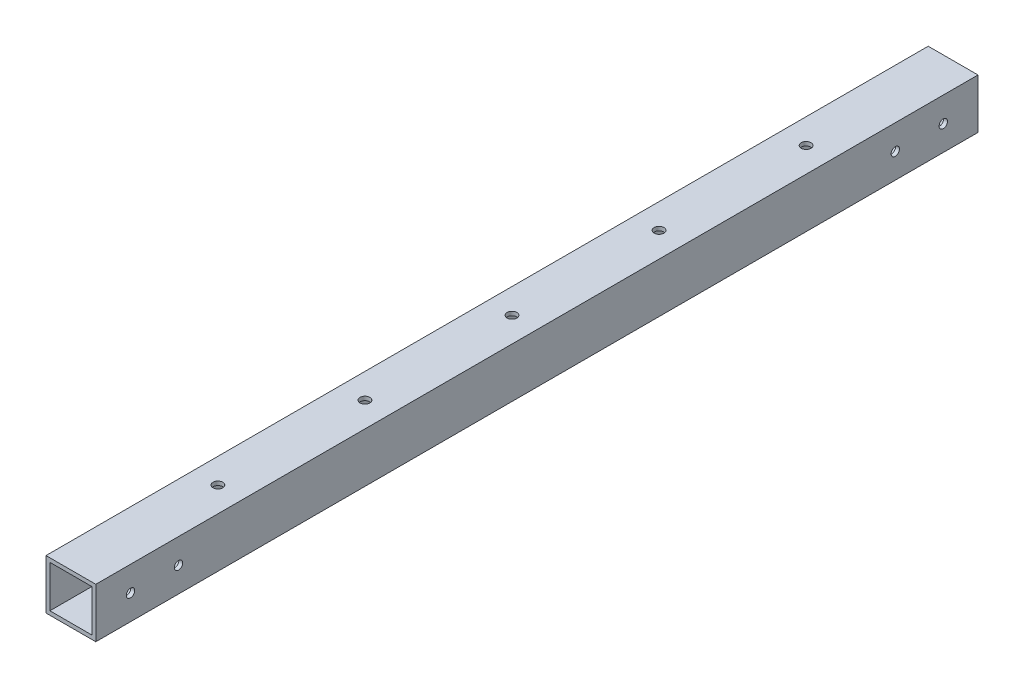
ISO-10303-21;
HEADER;
FILE_DESCRIPTION(('STEP AP214'),'2;1');
FILE_NAME('part.step','',(''),(''),'','','');
FILE_SCHEMA(('AUTOMOTIVE_DESIGN { 1 0 10303 214 1 1 1 1 }'));
ENDSEC;
DATA;
#1=APPLICATION_CONTEXT('core data for automotive mechanical design processes');
#2=APPLICATION_PROTOCOL_DEFINITION('international standard','automotive_design',2000,#1);
#3=PRODUCT_CONTEXT('',#1,'mechanical');
#4=PRODUCT('Part','Part','',(#3));
#5=PRODUCT_RELATED_PRODUCT_CATEGORY('part','',(#4));
#6=PRODUCT_DEFINITION_FORMATION('','',#4);
#7=PRODUCT_DEFINITION_CONTEXT('part definition',#1,'design');
#8=PRODUCT_DEFINITION('design','',#6,#7);
#9=PRODUCT_DEFINITION_SHAPE('','',#8);
#10=(LENGTH_UNIT() NAMED_UNIT(*) SI_UNIT(.MILLI.,.METRE.));
#11=(NAMED_UNIT(*) PLANE_ANGLE_UNIT() SI_UNIT($,.RADIAN.));
#12=(NAMED_UNIT(*) SI_UNIT($,.STERADIAN.) SOLID_ANGLE_UNIT());
#13=UNCERTAINTY_MEASURE_WITH_UNIT(LENGTH_MEASURE(1.E-05),#10,'distance_accuracy_value','');
#14=(GEOMETRIC_REPRESENTATION_CONTEXT(3) GLOBAL_UNCERTAINTY_ASSIGNED_CONTEXT((#13)) GLOBAL_UNIT_ASSIGNED_CONTEXT((#10,
#11,#12)) REPRESENTATION_CONTEXT('',''));
#15=CARTESIAN_POINT('',(0.,0.,0.));
#16=DIRECTION('',(0.,0.,1.));
#17=DIRECTION('',(1.,0.,0.));
#18=AXIS2_PLACEMENT_3D('',#15,#16,#17);
#19=CARTESIAN_POINT('',(0.,0.,450.));
#20=DIRECTION('',(0.,0.,1.));
#21=DIRECTION('',(1.,0.,0.));
#22=AXIS2_PLACEMENT_3D('',#19,#20,#21);
#23=PLANE('',#22);
#24=DIRECTION('',(0.,-1.,0.));
#25=VECTOR('',#24,1.);
#26=CARTESIAN_POINT('',(-12.7,12.7,450.));
#27=LINE('',#26,#25);
#28=CARTESIAN_POINT('',(-12.7,12.7,450.));
#29=VERTEX_POINT('',#28);
#30=CARTESIAN_POINT('',(-12.7,-12.7,450.));
#31=VERTEX_POINT('',#30);
#32=EDGE_CURVE('E140',#29,#31,#27,.T.);
#33=ORIENTED_EDGE('',*,*,#32,.T.);
#34=DIRECTION('',(1.,0.,0.));
#35=VECTOR('',#34,1.);
#36=CARTESIAN_POINT('',(-12.7,-12.7,450.));
#37=LINE('',#36,#35);
#38=CARTESIAN_POINT('',(12.7,-12.7,450.));
#39=VERTEX_POINT('',#38);
#40=EDGE_CURVE('E143',#31,#39,#37,.T.);
#41=ORIENTED_EDGE('',*,*,#40,.T.);
#42=DIRECTION('',(0.,-1.,0.));
#43=VECTOR('',#42,1.);
#44=CARTESIAN_POINT('',(12.7,12.7,450.));
#45=LINE('',#44,#43);
#46=CARTESIAN_POINT('',(12.7,12.7,450.));
#47=VERTEX_POINT('',#46);
#48=EDGE_CURVE('E146',#47,#39,#45,.T.);
#49=ORIENTED_EDGE('',*,*,#48,.F.);
#50=DIRECTION('',(1.,0.,0.));
#51=VECTOR('',#50,1.);
#52=CARTESIAN_POINT('',(-12.7,12.7,450.));
#53=LINE('',#52,#51);
#54=EDGE_CURVE('E149',#29,#47,#53,.T.);
#55=ORIENTED_EDGE('',*,*,#54,.F.);
#56=EDGE_LOOP('',(#33,#41,#49,#55));
#57=FACE_BOUND('',#56,.T.);
#58=DIRECTION('',(1.,0.,0.));
#59=VECTOR('',#58,1.);
#60=CARTESIAN_POINT('',(-10.7,-10.7,450.));
#61=LINE('',#60,#59);
#62=CARTESIAN_POINT('',(-10.7,-10.7,450.));
#63=VERTEX_POINT('',#62);
#64=CARTESIAN_POINT('',(10.7,-10.7,450.));
#65=VERTEX_POINT('',#64);
#66=EDGE_CURVE('E112',#63,#65,#61,.T.);
#67=ORIENTED_EDGE('',*,*,#66,.F.);
#68=DIRECTION('',(0.,-1.,0.));
#69=VECTOR('',#68,1.);
#70=CARTESIAN_POINT('',(-10.7,10.7,450.));
#71=LINE('',#70,#69);
#72=CARTESIAN_POINT('',(-10.7,10.7,450.));
#73=VERTEX_POINT('',#72);
#74=EDGE_CURVE('E103',#73,#63,#71,.T.);
#75=ORIENTED_EDGE('',*,*,#74,.F.);
#76=DIRECTION('',(1.,0.,0.));
#77=VECTOR('',#76,1.);
#78=CARTESIAN_POINT('',(-10.7,10.7,450.));
#79=LINE('',#78,#77);
#80=CARTESIAN_POINT('',(10.7,10.7,450.));
#81=VERTEX_POINT('',#80);
#82=EDGE_CURVE('E123',#73,#81,#79,.T.);
#83=ORIENTED_EDGE('',*,*,#82,.T.);
#84=DIRECTION('',(0.,-1.,0.));
#85=VECTOR('',#84,1.);
#86=CARTESIAN_POINT('',(10.7,10.7,450.));
#87=LINE('',#86,#85);
#88=EDGE_CURVE('E53',#81,#65,#87,.T.);
#89=ORIENTED_EDGE('',*,*,#88,.T.);
#90=EDGE_LOOP('',(#67,#75,#83,#89));
#91=FACE_BOUND('',#90,.T.);
#92=ADVANCED_FACE('F36',(#57,#91),#23,.T.);
#93=CARTESIAN_POINT('',(0.,0.,0.));
#94=DIRECTION('',(0.,0.,1.));
#95=DIRECTION('',(1.,0.,0.));
#96=AXIS2_PLACEMENT_3D('',#93,#94,#95);
#97=PLANE('',#96);
#98=DIRECTION('',(0.,-1.,0.));
#99=VECTOR('',#98,1.);
#100=CARTESIAN_POINT('',(-12.7,12.7,0.));
#101=LINE('',#100,#99);
#102=CARTESIAN_POINT('',(-12.7,12.7,0.));
#103=VERTEX_POINT('',#102);
#104=CARTESIAN_POINT('',(-12.7,-12.7,0.));
#105=VERTEX_POINT('',#104);
#106=EDGE_CURVE('E119',#103,#105,#101,.T.);
#107=ORIENTED_EDGE('',*,*,#106,.F.);
#108=DIRECTION('',(1.,0.,0.));
#109=VECTOR('',#108,1.);
#110=CARTESIAN_POINT('',(-12.7,12.7,0.));
#111=LINE('',#110,#109);
#112=CARTESIAN_POINT('',(12.7,12.7,0.));
#113=VERTEX_POINT('',#112);
#114=EDGE_CURVE('E144',#103,#113,#111,.T.);
#115=ORIENTED_EDGE('',*,*,#114,.T.);
#116=DIRECTION('',(0.,-1.,0.));
#117=VECTOR('',#116,1.);
#118=CARTESIAN_POINT('',(12.7,12.7,0.));
#119=LINE('',#118,#117);
#120=CARTESIAN_POINT('',(12.7,-12.7,0.));
#121=VERTEX_POINT('',#120);
#122=EDGE_CURVE('E158',#113,#121,#119,.T.);
#123=ORIENTED_EDGE('',*,*,#122,.T.);
#124=DIRECTION('',(1.,0.,0.));
#125=VECTOR('',#124,1.);
#126=CARTESIAN_POINT('',(-12.7,-12.7,0.));
#127=LINE('',#126,#125);
#128=EDGE_CURVE('E155',#105,#121,#127,.T.);
#129=ORIENTED_EDGE('',*,*,#128,.F.);
#130=EDGE_LOOP('',(#107,#115,#123,#129));
#131=FACE_BOUND('',#130,.T.);
#132=DIRECTION('',(0.,-1.,0.));
#133=VECTOR('',#132,1.);
#134=CARTESIAN_POINT('',(-10.7,10.7,0.));
#135=LINE('',#134,#133);
#136=CARTESIAN_POINT('',(-10.7,10.7,0.));
#137=VERTEX_POINT('',#136);
#138=CARTESIAN_POINT('',(-10.7,-10.7,0.));
#139=VERTEX_POINT('',#138);
#140=EDGE_CURVE('E61',#137,#139,#135,.T.);
#141=ORIENTED_EDGE('',*,*,#140,.T.);
#142=DIRECTION('',(1.,0.,0.));
#143=VECTOR('',#142,1.);
#144=CARTESIAN_POINT('',(-10.7,-10.7,0.));
#145=LINE('',#144,#143);
#146=CARTESIAN_POINT('',(10.7,-10.7,0.));
#147=VERTEX_POINT('',#146);
#148=EDGE_CURVE('E118',#139,#147,#145,.T.);
#149=ORIENTED_EDGE('',*,*,#148,.T.);
#150=DIRECTION('',(0.,-1.,0.));
#151=VECTOR('',#150,1.);
#152=CARTESIAN_POINT('',(10.7,10.7,0.));
#153=LINE('',#152,#151);
#154=CARTESIAN_POINT('',(10.7,10.7,0.));
#155=VERTEX_POINT('',#154);
#156=EDGE_CURVE('E131',#155,#147,#153,.T.);
#157=ORIENTED_EDGE('',*,*,#156,.F.);
#158=DIRECTION('',(1.,0.,0.));
#159=VECTOR('',#158,1.);
#160=CARTESIAN_POINT('',(-10.7,10.7,0.));
#161=LINE('',#160,#159);
#162=EDGE_CURVE('E113',#137,#155,#161,.T.);
#163=ORIENTED_EDGE('',*,*,#162,.F.);
#164=EDGE_LOOP('',(#141,#149,#157,#163));
#165=FACE_BOUND('',#164,.T.);
#166=ADVANCED_FACE('F269',(#131,#165),#97,.F.);
#167=CARTESIAN_POINT('',(-12.7,12.7,450.));
#168=DIRECTION('',(1.,0.,0.));
#169=DIRECTION('',(0.,1.,0.));
#170=AXIS2_PLACEMENT_3D('',#167,#168,#169);
#171=PLANE('',#170);
#172=CARTESIAN_POINT('',(-12.7,0.,375.));
#173=DIRECTION('',(-1.,0.,0.));
#174=DIRECTION('',(0.,-1.,0.));
#175=AXIS2_PLACEMENT_3D('',#172,#173,#174);
#176=CIRCLE('',#175,2.50000000000002);
#177=CARTESIAN_POINT('',(-12.7,-2.50000000000003,375.));
#178=VERTEX_POINT('',#177);
#179=EDGE_CURVE('E218',#178,#178,#176,.T.);
#180=ORIENTED_EDGE('',*,*,#179,.F.);
#181=EDGE_LOOP('',(#180));
#182=FACE_BOUND('',#181,.T.);
#183=CARTESIAN_POINT('',(-12.7,0.,300.));
#184=DIRECTION('',(-1.,0.,0.));
#185=DIRECTION('',(0.,-1.,0.));
#186=AXIS2_PLACEMENT_3D('',#183,#184,#185);
#187=CIRCLE('',#186,2.50000000000002);
#188=CARTESIAN_POINT('',(-12.7,-2.50000000000003,300.));
#189=VERTEX_POINT('',#188);
#190=EDGE_CURVE('E420',#189,#189,#187,.T.);
#191=ORIENTED_EDGE('',*,*,#190,.F.);
#192=EDGE_LOOP('',(#191));
#193=FACE_BOUND('',#192,.T.);
#194=CARTESIAN_POINT('',(-12.7,0.,225.));
#195=DIRECTION('',(-1.,0.,0.));
#196=DIRECTION('',(0.,-1.,0.));
#197=AXIS2_PLACEMENT_3D('',#194,#195,#196);
#198=CIRCLE('',#197,2.5);
#199=CARTESIAN_POINT('',(-12.7,-2.50000000000001,225.));
#200=VERTEX_POINT('',#199);
#201=EDGE_CURVE('E423',#200,#200,#198,.T.);
#202=ORIENTED_EDGE('',*,*,#201,.F.);
#203=EDGE_LOOP('',(#202));
#204=FACE_BOUND('',#203,.T.);
#205=CARTESIAN_POINT('',(-12.7,0.,150.));
#206=DIRECTION('',(-1.,0.,0.));
#207=DIRECTION('',(0.,-1.,0.));
#208=AXIS2_PLACEMENT_3D('',#205,#206,#207);
#209=CIRCLE('',#208,2.5);
#210=CARTESIAN_POINT('',(-12.7,-2.50000000000001,150.));
#211=VERTEX_POINT('',#210);
#212=EDGE_CURVE('E428',#211,#211,#209,.T.);
#213=ORIENTED_EDGE('',*,*,#212,.F.);
#214=EDGE_LOOP('',(#213));
#215=FACE_BOUND('',#214,.T.);
#216=CARTESIAN_POINT('',(-12.7,0.,75.));
#217=DIRECTION('',(-1.,0.,0.));
#218=DIRECTION('',(0.,-1.,0.));
#219=AXIS2_PLACEMENT_3D('',#216,#217,#218);
#220=CIRCLE('',#219,2.50000000000001);
#221=CARTESIAN_POINT('',(-12.7,-2.50000000000002,75.));
#222=VERTEX_POINT('',#221);
#223=EDGE_CURVE('E431',#222,#222,#220,.T.);
#224=ORIENTED_EDGE('',*,*,#223,.F.);
#225=EDGE_LOOP('',(#224));
#226=FACE_BOUND('',#225,.T.);
#227=ORIENTED_EDGE('',*,*,#106,.T.);
#228=DIRECTION('',(0.,0.,-1.));
#229=VECTOR('',#228,1.);
#230=CARTESIAN_POINT('',(-12.7,-12.7,450.));
#231=LINE('',#230,#229);
#232=EDGE_CURVE('E11',#31,#105,#231,.T.);
#233=ORIENTED_EDGE('',*,*,#232,.F.);
#234=ORIENTED_EDGE('',*,*,#32,.F.);
#235=DIRECTION('',(0.,0.,-1.));
#236=VECTOR('',#235,1.);
#237=CARTESIAN_POINT('',(-12.7,12.7,450.));
#238=LINE('',#237,#236);
#239=EDGE_CURVE('E152',#29,#103,#238,.T.);
#240=ORIENTED_EDGE('',*,*,#239,.T.);
#241=EDGE_LOOP('',(#227,#233,#234,#240));
#242=FACE_BOUND('',#241,.T.);
#243=ADVANCED_FACE('F38',(#182,#193,#204,#215,#226,#242),#171,.F.);
#244=CARTESIAN_POINT('',(-12.7,-12.7,450.));
#245=DIRECTION('',(0.,1.,0.));
#246=DIRECTION('',(0.,0.,1.));
#247=AXIS2_PLACEMENT_3D('',#244,#245,#246);
#248=PLANE('',#247);
#249=CARTESIAN_POINT('',(-9.97986415729457E-12,-12.7,407.8));
#250=DIRECTION('',(0.,-1.,0.));
#251=DIRECTION('',(0.,0.,-1.));
#252=AXIS2_PLACEMENT_3D('',#249,#250,#251);
#253=CIRCLE('',#252,2.14999999997024);
#254=CARTESIAN_POINT('',(-9.97986415729457E-12,-12.7,405.65000000003));
#255=VERTEX_POINT('',#254);
#256=EDGE_CURVE('E193',#255,#255,#253,.T.);
#257=ORIENTED_EDGE('',*,*,#256,.F.);
#258=EDGE_LOOP('',(#257));
#259=FACE_BOUND('',#258,.T.);
#260=CARTESIAN_POINT('',(-9.9703231781767E-12,-12.7,432.3));
#261=DIRECTION('',(0.,-1.,0.));
#262=DIRECTION('',(0.,0.,-1.));
#263=AXIS2_PLACEMENT_3D('',#260,#261,#262);
#264=CIRCLE('',#263,2.14999999997024);
#265=CARTESIAN_POINT('',(-9.9703231781767E-12,-12.7,430.15000000003));
#266=VERTEX_POINT('',#265);
#267=EDGE_CURVE('E213',#266,#266,#264,.T.);
#268=ORIENTED_EDGE('',*,*,#267,.F.);
#269=EDGE_LOOP('',(#268));
#270=FACE_BOUND('',#269,.T.);
#271=CARTESIAN_POINT('',(-2.38426899751287E-12,-12.7,17.6999999999975));
#272=DIRECTION('',(0.,-1.,0.));
#273=DIRECTION('',(0.,0.,-1.));
#274=AXIS2_PLACEMENT_3D('',#271,#272,#273);
#275=CIRCLE('',#274,2.14999999999999);
#276=CARTESIAN_POINT('',(-2.38426899751287E-12,-12.7,15.5499999999975));
#277=VERTEX_POINT('',#276);
#278=EDGE_CURVE('E170',#277,#277,#275,.T.);
#279=ORIENTED_EDGE('',*,*,#278,.F.);
#280=EDGE_LOOP('',(#279));
#281=FACE_BOUND('',#280,.T.);
#282=CARTESIAN_POINT('',(-2.30056858979699E-12,-12.7,42.1999999999975));
#283=DIRECTION('',(0.,-1.,0.));
#284=DIRECTION('',(0.,0.,-1.));
#285=AXIS2_PLACEMENT_3D('',#282,#283,#284);
#286=CIRCLE('',#285,2.15);
#287=CARTESIAN_POINT('',(-2.30056858979699E-12,-12.7,40.0499999999975));
#288=VERTEX_POINT('',#287);
#289=EDGE_CURVE('E180',#288,#288,#286,.T.);
#290=ORIENTED_EDGE('',*,*,#289,.F.);
#291=EDGE_LOOP('',(#290));
#292=FACE_BOUND('',#291,.T.);
#293=ORIENTED_EDGE('',*,*,#128,.T.);
#294=DIRECTION('',(0.,0.,-1.));
#295=VECTOR('',#294,1.);
#296=CARTESIAN_POINT('',(12.7,-12.7,450.));
#297=LINE('',#296,#295);
#298=EDGE_CURVE('E45',#39,#121,#297,.T.);
#299=ORIENTED_EDGE('',*,*,#298,.F.);
#300=ORIENTED_EDGE('',*,*,#40,.F.);
#301=ORIENTED_EDGE('',*,*,#232,.T.);
#302=EDGE_LOOP('',(#293,#299,#300,#301));
#303=FACE_BOUND('',#302,.T.);
#304=ADVANCED_FACE('F259',(#259,#270,#281,#292,#303),#248,.F.);
#305=CARTESIAN_POINT('',(12.7,12.7,450.));
#306=DIRECTION('',(1.,0.,0.));
#307=DIRECTION('',(0.,1.,0.));
#308=AXIS2_PLACEMENT_3D('',#305,#306,#307);
#309=PLANE('',#308);
#310=CARTESIAN_POINT('',(12.7,0.,407.8));
#311=DIRECTION('',(1.,0.,0.));
#312=DIRECTION('',(0.,1.,0.));
#313=AXIS2_PLACEMENT_3D('',#310,#311,#312);
#314=CIRCLE('',#313,2.15000000000002);
#315=CARTESIAN_POINT('',(12.7,2.15000000000002,407.8));
#316=VERTEX_POINT('',#315);
#317=EDGE_CURVE('E185',#316,#316,#314,.T.);
#318=ORIENTED_EDGE('',*,*,#317,.F.);
#319=EDGE_LOOP('',(#318));
#320=FACE_BOUND('',#319,.T.);
#321=CARTESIAN_POINT('',(12.7,0.,432.3));
#322=DIRECTION('',(1.,0.,0.));
#323=DIRECTION('',(0.,1.,0.));
#324=AXIS2_PLACEMENT_3D('',#321,#322,#323);
#325=CIRCLE('',#324,2.15000000000002);
#326=CARTESIAN_POINT('',(12.7,2.15000000000001,432.3));
#327=VERTEX_POINT('',#326);
#328=EDGE_CURVE('E196',#327,#327,#325,.T.);
#329=ORIENTED_EDGE('',*,*,#328,.F.);
#330=EDGE_LOOP('',(#329));
#331=FACE_BOUND('',#330,.T.);
#332=CARTESIAN_POINT('',(12.7,-1.45477441250132E-13,42.1999999999975));
#333=DIRECTION('',(1.,0.,0.));
#334=DIRECTION('',(0.,1.,0.));
#335=AXIS2_PLACEMENT_3D('',#332,#333,#334);
#336=CIRCLE('',#335,2.14999999986953);
#337=CARTESIAN_POINT('',(12.7,2.14999999986938,42.1999999999975));
#338=VERTEX_POINT('',#337);
#339=EDGE_CURVE('E177',#338,#338,#336,.T.);
#340=ORIENTED_EDGE('',*,*,#339,.F.);
#341=EDGE_LOOP('',(#340));
#342=FACE_BOUND('',#341,.T.);
#343=CARTESIAN_POINT('',(12.7,-1.45717245263134E-13,17.6999999999975));
#344=DIRECTION('',(1.,0.,0.));
#345=DIRECTION('',(0.,1.,0.));
#346=AXIS2_PLACEMENT_3D('',#343,#344,#345);
#347=CIRCLE('',#346,2.14999999975027);
#348=CARTESIAN_POINT('',(12.7,2.14999999975012,17.6999999999975));
#349=VERTEX_POINT('',#348);
#350=EDGE_CURVE('E188',#349,#349,#347,.T.);
#351=ORIENTED_EDGE('',*,*,#350,.F.);
#352=EDGE_LOOP('',(#351));
#353=FACE_BOUND('',#352,.T.);
#354=ORIENTED_EDGE('',*,*,#122,.F.);
#355=DIRECTION('',(0.,0.,-1.));
#356=VECTOR('',#355,1.);
#357=CARTESIAN_POINT('',(12.7,12.7,450.));
#358=LINE('',#357,#356);
#359=EDGE_CURVE('E164',#47,#113,#358,.T.);
#360=ORIENTED_EDGE('',*,*,#359,.F.);
#361=ORIENTED_EDGE('',*,*,#48,.T.);
#362=ORIENTED_EDGE('',*,*,#298,.T.);
#363=EDGE_LOOP('',(#354,#360,#361,#362));
#364=FACE_BOUND('',#363,.T.);
#365=ADVANCED_FACE('F262',(#320,#331,#342,#353,#364),#309,.T.);
#366=CARTESIAN_POINT('',(-12.7,12.7,450.));
#367=DIRECTION('',(0.,1.,0.));
#368=DIRECTION('',(0.,0.,1.));
#369=AXIS2_PLACEMENT_3D('',#366,#367,#368);
#370=PLANE('',#369);
#371=CARTESIAN_POINT('',(0.,12.7,375.));
#372=DIRECTION('',(0.,1.,0.));
#373=DIRECTION('',(0.,0.,1.));
#374=AXIS2_PLACEMENT_3D('',#371,#372,#373);
#375=CIRCLE('',#374,2.5);
#376=CARTESIAN_POINT('',(0.,12.7,377.5));
#377=VERTEX_POINT('',#376);
#378=EDGE_CURVE('E201',#377,#377,#375,.T.);
#379=ORIENTED_EDGE('',*,*,#378,.F.);
#380=EDGE_LOOP('',(#379));
#381=FACE_BOUND('',#380,.T.);
#382=CARTESIAN_POINT('',(0.,12.7,300.));
#383=DIRECTION('',(0.,1.,0.));
#384=DIRECTION('',(0.,0.,1.));
#385=AXIS2_PLACEMENT_3D('',#382,#383,#384);
#386=CIRCLE('',#385,2.5);
#387=CARTESIAN_POINT('',(0.,12.7,302.5));
#388=VERTEX_POINT('',#387);
#389=EDGE_CURVE('E436',#388,#388,#386,.T.);
#390=ORIENTED_EDGE('',*,*,#389,.F.);
#391=EDGE_LOOP('',(#390));
#392=FACE_BOUND('',#391,.T.);
#393=CARTESIAN_POINT('',(0.,12.7,225.));
#394=DIRECTION('',(0.,1.,0.));
#395=DIRECTION('',(0.,0.,1.));
#396=AXIS2_PLACEMENT_3D('',#393,#394,#395);
#397=CIRCLE('',#396,2.5);
#398=CARTESIAN_POINT('',(0.,12.7,227.5));
#399=VERTEX_POINT('',#398);
#400=EDGE_CURVE('E237',#399,#399,#397,.T.);
#401=ORIENTED_EDGE('',*,*,#400,.F.);
#402=EDGE_LOOP('',(#401));
#403=FACE_BOUND('',#402,.T.);
#404=CARTESIAN_POINT('',(0.,12.7,150.));
#405=DIRECTION('',(0.,1.,0.));
#406=DIRECTION('',(0.,0.,1.));
#407=AXIS2_PLACEMENT_3D('',#404,#405,#406);
#408=CIRCLE('',#407,2.5);
#409=CARTESIAN_POINT('',(0.,12.7,152.5));
#410=VERTEX_POINT('',#409);
#411=EDGE_CURVE('E232',#410,#410,#408,.T.);
#412=ORIENTED_EDGE('',*,*,#411,.F.);
#413=EDGE_LOOP('',(#412));
#414=FACE_BOUND('',#413,.T.);
#415=CARTESIAN_POINT('',(0.,12.7,75.));
#416=DIRECTION('',(0.,1.,0.));
#417=DIRECTION('',(0.,0.,1.));
#418=AXIS2_PLACEMENT_3D('',#415,#416,#417);
#419=CIRCLE('',#418,2.5);
#420=CARTESIAN_POINT('',(0.,12.7,77.5));
#421=VERTEX_POINT('',#420);
#422=EDGE_CURVE('E228',#421,#421,#419,.T.);
#423=ORIENTED_EDGE('',*,*,#422,.F.);
#424=EDGE_LOOP('',(#423));
#425=FACE_BOUND('',#424,.T.);
#426=ORIENTED_EDGE('',*,*,#114,.F.);
#427=ORIENTED_EDGE('',*,*,#239,.F.);
#428=ORIENTED_EDGE('',*,*,#54,.T.);
#429=ORIENTED_EDGE('',*,*,#359,.T.);
#430=EDGE_LOOP('',(#426,#427,#428,#429));
#431=FACE_BOUND('',#430,.T.);
#432=ADVANCED_FACE('F277',(#381,#392,#403,#414,#425,#431),#370,.T.);
#433=CARTESIAN_POINT('',(-10.7,10.7,450.));
#434=DIRECTION('',(1.,0.,0.));
#435=DIRECTION('',(0.,0.,-1.));
#436=AXIS2_PLACEMENT_3D('',#433,#434,#435);
#437=PLANE('',#436);
#438=CARTESIAN_POINT('',(-10.7,0.,375.));
#439=DIRECTION('',(1.,0.,0.));
#440=DIRECTION('',(0.,0.,-1.));
#441=AXIS2_PLACEMENT_3D('',#438,#439,#440);
#442=CIRCLE('',#441,2.50000000000002);
#443=CARTESIAN_POINT('',(-10.7,0.,372.5));
#444=VERTEX_POINT('',#443);
#445=EDGE_CURVE('E40',#444,#444,#442,.T.);
#446=ORIENTED_EDGE('',*,*,#445,.F.);
#447=EDGE_LOOP('',(#446));
#448=FACE_BOUND('',#447,.T.);
#449=CARTESIAN_POINT('',(-10.7,0.,300.));
#450=DIRECTION('',(1.,0.,0.));
#451=DIRECTION('',(0.,0.,-1.));
#452=AXIS2_PLACEMENT_3D('',#449,#450,#451);
#453=CIRCLE('',#452,2.50000000000002);
#454=CARTESIAN_POINT('',(-10.7,0.,297.5));
#455=VERTEX_POINT('',#454);
#456=EDGE_CURVE('E223',#455,#455,#453,.T.);
#457=ORIENTED_EDGE('',*,*,#456,.F.);
#458=EDGE_LOOP('',(#457));
#459=FACE_BOUND('',#458,.T.);
#460=CARTESIAN_POINT('',(-10.7,0.,225.));
#461=DIRECTION('',(1.,0.,0.));
#462=DIRECTION('',(0.,0.,-1.));
#463=AXIS2_PLACEMENT_3D('',#460,#461,#462);
#464=CIRCLE('',#463,2.5);
#465=CARTESIAN_POINT('',(-10.7,0.,222.5));
#466=VERTEX_POINT('',#465);
#467=EDGE_CURVE('E221',#466,#466,#464,.T.);
#468=ORIENTED_EDGE('',*,*,#467,.F.);
#469=EDGE_LOOP('',(#468));
#470=FACE_BOUND('',#469,.T.);
#471=CARTESIAN_POINT('',(-10.7,0.,150.));
#472=DIRECTION('',(1.,0.,0.));
#473=DIRECTION('',(0.,0.,-1.));
#474=AXIS2_PLACEMENT_3D('',#471,#472,#473);
#475=CIRCLE('',#474,2.5);
#476=CARTESIAN_POINT('',(-10.7,0.,147.5));
#477=VERTEX_POINT('',#476);
#478=EDGE_CURVE('E217',#477,#477,#475,.T.);
#479=ORIENTED_EDGE('',*,*,#478,.F.);
#480=EDGE_LOOP('',(#479));
#481=FACE_BOUND('',#480,.T.);
#482=CARTESIAN_POINT('',(-10.7,0.,75.));
#483=DIRECTION('',(1.,0.,0.));
#484=DIRECTION('',(0.,0.,-1.));
#485=AXIS2_PLACEMENT_3D('',#482,#483,#484);
#486=CIRCLE('',#485,2.50000000000001);
#487=CARTESIAN_POINT('',(-10.7,0.,72.5));
#488=VERTEX_POINT('',#487);
#489=EDGE_CURVE('E214',#488,#488,#486,.T.);
#490=ORIENTED_EDGE('',*,*,#489,.F.);
#491=EDGE_LOOP('',(#490));
#492=FACE_BOUND('',#491,.T.);
#493=ORIENTED_EDGE('',*,*,#140,.F.);
#494=DIRECTION('',(0.,0.,-1.));
#495=VECTOR('',#494,1.);
#496=CARTESIAN_POINT('',(-10.7,10.7,450.));
#497=LINE('',#496,#495);
#498=EDGE_CURVE('E107',#73,#137,#497,.T.);
#499=ORIENTED_EDGE('',*,*,#498,.F.);
#500=ORIENTED_EDGE('',*,*,#74,.T.);
#501=DIRECTION('',(0.,0.,-1.));
#502=VECTOR('',#501,1.);
#503=CARTESIAN_POINT('',(-10.7,-10.7,450.));
#504=LINE('',#503,#502);
#505=EDGE_CURVE('E106',#63,#139,#504,.T.);
#506=ORIENTED_EDGE('',*,*,#505,.T.);
#507=EDGE_LOOP('',(#493,#499,#500,#506));
#508=FACE_BOUND('',#507,.T.);
#509=ADVANCED_FACE('F105',(#448,#459,#470,#481,#492,#508),#437,.T.);
#510=CARTESIAN_POINT('',(-10.7,-10.7,450.));
#511=DIRECTION('',(0.,1.,0.));
#512=DIRECTION('',(-1.,0.,0.));
#513=AXIS2_PLACEMENT_3D('',#510,#511,#512);
#514=PLANE('',#513);
#515=CARTESIAN_POINT('',(-9.97986415729457E-12,-10.7,407.8));
#516=DIRECTION('',(0.,1.,0.));
#517=DIRECTION('',(-1.,0.,0.));
#518=AXIS2_PLACEMENT_3D('',#515,#516,#517);
#519=CIRCLE('',#518,2.14999999997024);
#520=CARTESIAN_POINT('',(-2.14999999998022,-10.7,407.8));
#521=VERTEX_POINT('',#520);
#522=EDGE_CURVE('E192',#521,#521,#519,.T.);
#523=ORIENTED_EDGE('',*,*,#522,.F.);
#524=EDGE_LOOP('',(#523));
#525=FACE_BOUND('',#524,.T.);
#526=CARTESIAN_POINT('',(-9.9703231781767E-12,-10.7,432.3));
#527=DIRECTION('',(0.,1.,0.));
#528=DIRECTION('',(-1.,0.,0.));
#529=AXIS2_PLACEMENT_3D('',#526,#527,#528);
#530=CIRCLE('',#529,2.14999999997024);
#531=CARTESIAN_POINT('',(-2.14999999998021,-10.7,432.3));
#532=VERTEX_POINT('',#531);
#533=EDGE_CURVE('E189',#532,#532,#530,.T.);
#534=ORIENTED_EDGE('',*,*,#533,.F.);
#535=EDGE_LOOP('',(#534));
#536=FACE_BOUND('',#535,.T.);
#537=CARTESIAN_POINT('',(-2.38426899751287E-12,-10.7,17.6999999999975));
#538=DIRECTION('',(0.,1.,0.));
#539=DIRECTION('',(-1.,0.,0.));
#540=AXIS2_PLACEMENT_3D('',#537,#538,#539);
#541=CIRCLE('',#540,2.14999999999999);
#542=CARTESIAN_POINT('',(-2.15000000000237,-10.7,17.6999999999975));
#543=VERTEX_POINT('',#542);
#544=EDGE_CURVE('E129',#543,#543,#541,.T.);
#545=ORIENTED_EDGE('',*,*,#544,.F.);
#546=EDGE_LOOP('',(#545));
#547=FACE_BOUND('',#546,.T.);
#548=CARTESIAN_POINT('',(-2.30056858979699E-12,-10.7,42.1999999999975));
#549=DIRECTION('',(0.,1.,0.));
#550=DIRECTION('',(-1.,0.,0.));
#551=AXIS2_PLACEMENT_3D('',#548,#549,#550);
#552=CIRCLE('',#551,2.15);
#553=CARTESIAN_POINT('',(-2.1500000000023,-10.7,42.1999999999975));
#554=VERTEX_POINT('',#553);
#555=EDGE_CURVE('E167',#554,#554,#552,.T.);
#556=ORIENTED_EDGE('',*,*,#555,.F.);
#557=EDGE_LOOP('',(#556));
#558=FACE_BOUND('',#557,.T.);
#559=ORIENTED_EDGE('',*,*,#148,.F.);
#560=ORIENTED_EDGE('',*,*,#505,.F.);
#561=ORIENTED_EDGE('',*,*,#66,.T.);
#562=DIRECTION('',(0.,0.,-1.));
#563=VECTOR('',#562,1.);
#564=CARTESIAN_POINT('',(10.7,-10.7,450.));
#565=LINE('',#564,#563);
#566=EDGE_CURVE('E120',#65,#147,#565,.T.);
#567=ORIENTED_EDGE('',*,*,#566,.T.);
#568=EDGE_LOOP('',(#559,#560,#561,#567));
#569=FACE_BOUND('',#568,.T.);
#570=ADVANCED_FACE('F116',(#525,#536,#547,#558,#569),#514,.T.);
#571=CARTESIAN_POINT('',(10.7,10.7,450.));
#572=DIRECTION('',(1.,0.,0.));
#573=DIRECTION('',(0.,1.,0.));
#574=AXIS2_PLACEMENT_3D('',#571,#572,#573);
#575=PLANE('',#574);
#576=CARTESIAN_POINT('',(10.7,0.,407.8));
#577=DIRECTION('',(1.,0.,0.));
#578=DIRECTION('',(0.,1.,0.));
#579=AXIS2_PLACEMENT_3D('',#576,#577,#578);
#580=CIRCLE('',#579,2.15000000000002);
#581=CARTESIAN_POINT('',(10.7,2.15000000000002,407.8));
#582=VERTEX_POINT('',#581);
#583=EDGE_CURVE('E184',#582,#582,#580,.T.);
#584=ORIENTED_EDGE('',*,*,#583,.T.);
#585=EDGE_LOOP('',(#584));
#586=FACE_BOUND('',#585,.T.);
#587=CARTESIAN_POINT('',(10.7,0.,432.3));
#588=DIRECTION('',(1.,0.,0.));
#589=DIRECTION('',(0.,1.,0.));
#590=AXIS2_PLACEMENT_3D('',#587,#588,#589);
#591=CIRCLE('',#590,2.15000000000002);
#592=CARTESIAN_POINT('',(10.7,2.15000000000001,432.3));
#593=VERTEX_POINT('',#592);
#594=EDGE_CURVE('E181',#593,#593,#591,.T.);
#595=ORIENTED_EDGE('',*,*,#594,.T.);
#596=EDGE_LOOP('',(#595));
#597=FACE_BOUND('',#596,.T.);
#598=CARTESIAN_POINT('',(10.7,-1.45750626049499E-13,42.1999999999975));
#599=DIRECTION('',(1.,0.,0.));
#600=DIRECTION('',(0.,1.,0.));
#601=AXIS2_PLACEMENT_3D('',#598,#599,#600);
#602=CIRCLE('',#601,2.14999999986953);
#603=CARTESIAN_POINT('',(10.7,2.14999999986938,42.1999999999975));
#604=VERTEX_POINT('',#603);
#605=EDGE_CURVE('E176',#604,#604,#602,.T.);
#606=ORIENTED_EDGE('',*,*,#605,.T.);
#607=EDGE_LOOP('',(#606));
#608=FACE_BOUND('',#607,.T.);
#609=CARTESIAN_POINT('',(10.7,-1.45990430062501E-13,17.6999999999975));
#610=DIRECTION('',(1.,0.,0.));
#611=DIRECTION('',(0.,1.,0.));
#612=AXIS2_PLACEMENT_3D('',#609,#610,#611);
#613=CIRCLE('',#612,2.14999999975027);
#614=CARTESIAN_POINT('',(10.7,2.14999999975012,17.6999999999975));
#615=VERTEX_POINT('',#614);
#616=EDGE_CURVE('E173',#615,#615,#613,.T.);
#617=ORIENTED_EDGE('',*,*,#616,.T.);
#618=EDGE_LOOP('',(#617));
#619=FACE_BOUND('',#618,.T.);
#620=ORIENTED_EDGE('',*,*,#156,.T.);
#621=ORIENTED_EDGE('',*,*,#566,.F.);
#622=ORIENTED_EDGE('',*,*,#88,.F.);
#623=DIRECTION('',(0.,0.,-1.));
#624=VECTOR('',#623,1.);
#625=CARTESIAN_POINT('',(10.7,10.7,450.));
#626=LINE('',#625,#624);
#627=EDGE_CURVE('E137',#81,#155,#626,.T.);
#628=ORIENTED_EDGE('',*,*,#627,.T.);
#629=EDGE_LOOP('',(#620,#621,#622,#628));
#630=FACE_BOUND('',#629,.T.);
#631=ADVANCED_FACE('F322',(#586,#597,#608,#619,#630),#575,.F.);
#632=CARTESIAN_POINT('',(-10.7,10.7,450.));
#633=DIRECTION('',(0.,1.,0.));
#634=DIRECTION('',(0.,0.,1.));
#635=AXIS2_PLACEMENT_3D('',#632,#633,#634);
#636=PLANE('',#635);
#637=CARTESIAN_POINT('',(0.,10.7,375.));
#638=DIRECTION('',(0.,1.,0.));
#639=DIRECTION('',(0.,0.,1.));
#640=AXIS2_PLACEMENT_3D('',#637,#638,#639);
#641=CIRCLE('',#640,2.5);
#642=CARTESIAN_POINT('',(0.,10.7,377.5));
#643=VERTEX_POINT('',#642);
#644=EDGE_CURVE('E210',#643,#643,#641,.T.);
#645=ORIENTED_EDGE('',*,*,#644,.T.);
#646=EDGE_LOOP('',(#645));
#647=FACE_BOUND('',#646,.T.);
#648=CARTESIAN_POINT('',(0.,10.7,300.));
#649=DIRECTION('',(0.,1.,0.));
#650=DIRECTION('',(0.,0.,1.));
#651=AXIS2_PLACEMENT_3D('',#648,#649,#650);
#652=CIRCLE('',#651,2.5);
#653=CARTESIAN_POINT('',(0.,10.7,302.5));
#654=VERTEX_POINT('',#653);
#655=EDGE_CURVE('E207',#654,#654,#652,.T.);
#656=ORIENTED_EDGE('',*,*,#655,.T.);
#657=EDGE_LOOP('',(#656));
#658=FACE_BOUND('',#657,.T.);
#659=CARTESIAN_POINT('',(0.,10.7,225.));
#660=DIRECTION('',(0.,1.,0.));
#661=DIRECTION('',(0.,0.,1.));
#662=AXIS2_PLACEMENT_3D('',#659,#660,#661);
#663=CIRCLE('',#662,2.5);
#664=CARTESIAN_POINT('',(0.,10.7,227.5));
#665=VERTEX_POINT('',#664);
#666=EDGE_CURVE('E204',#665,#665,#663,.T.);
#667=ORIENTED_EDGE('',*,*,#666,.T.);
#668=EDGE_LOOP('',(#667));
#669=FACE_BOUND('',#668,.T.);
#670=CARTESIAN_POINT('',(0.,10.7,150.));
#671=DIRECTION('',(0.,1.,0.));
#672=DIRECTION('',(0.,0.,1.));
#673=AXIS2_PLACEMENT_3D('',#670,#671,#672);
#674=CIRCLE('',#673,2.5);
#675=CARTESIAN_POINT('',(0.,10.7,152.5));
#676=VERTEX_POINT('',#675);
#677=EDGE_CURVE('E200',#676,#676,#674,.T.);
#678=ORIENTED_EDGE('',*,*,#677,.T.);
#679=EDGE_LOOP('',(#678));
#680=FACE_BOUND('',#679,.T.);
#681=CARTESIAN_POINT('',(0.,10.7,75.));
#682=DIRECTION('',(0.,1.,0.));
#683=DIRECTION('',(0.,0.,1.));
#684=AXIS2_PLACEMENT_3D('',#681,#682,#683);
#685=CIRCLE('',#684,2.5);
#686=CARTESIAN_POINT('',(0.,10.7,77.5));
#687=VERTEX_POINT('',#686);
#688=EDGE_CURVE('E197',#687,#687,#685,.T.);
#689=ORIENTED_EDGE('',*,*,#688,.T.);
#690=EDGE_LOOP('',(#689));
#691=FACE_BOUND('',#690,.T.);
#692=ORIENTED_EDGE('',*,*,#162,.T.);
#693=ORIENTED_EDGE('',*,*,#627,.F.);
#694=ORIENTED_EDGE('',*,*,#82,.F.);
#695=ORIENTED_EDGE('',*,*,#498,.T.);
#696=EDGE_LOOP('',(#692,#693,#694,#695));
#697=FACE_BOUND('',#696,.T.);
#698=ADVANCED_FACE('F323',(#647,#658,#669,#680,#691,#697),#636,.F.);
#699=CARTESIAN_POINT('',(-2.30056858979699E-12,-9.7,42.1999999999975));
#700=DIRECTION('',(0.,-1.,0.));
#701=DIRECTION('',(0.,0.,-1.));
#702=AXIS2_PLACEMENT_3D('',#699,#700,#701);
#703=CYLINDRICAL_SURFACE('',#702,2.15);
#704=ORIENTED_EDGE('',*,*,#555,.T.);
#705=EDGE_LOOP('',(#704));
#706=FACE_BOUND('',#705,.T.);
#707=ORIENTED_EDGE('',*,*,#289,.T.);
#708=EDGE_LOOP('',(#707));
#709=FACE_BOUND('',#708,.T.);
#710=ADVANCED_FACE('F257',(#706,#709),#703,.F.);
#711=CARTESIAN_POINT('',(-2.38426899751287E-12,-9.7,17.6999999999975));
#712=DIRECTION('',(0.,-1.,0.));
#713=DIRECTION('',(0.,0.,-1.));
#714=AXIS2_PLACEMENT_3D('',#711,#712,#713);
#715=CYLINDRICAL_SURFACE('',#714,2.14999999999999);
#716=ORIENTED_EDGE('',*,*,#544,.T.);
#717=EDGE_LOOP('',(#716));
#718=FACE_BOUND('',#717,.T.);
#719=ORIENTED_EDGE('',*,*,#278,.T.);
#720=EDGE_LOOP('',(#719));
#721=FACE_BOUND('',#720,.T.);
#722=ADVANCED_FACE('F318',(#718,#721),#715,.F.);
#723=CARTESIAN_POINT('',(9.7,-1.46127022462184E-13,17.6999999999975));
#724=DIRECTION('',(1.,0.,0.));
#725=DIRECTION('',(0.,1.,0.));
#726=AXIS2_PLACEMENT_3D('',#723,#724,#725);
#727=CYLINDRICAL_SURFACE('',#726,2.14999999975027);
#728=ORIENTED_EDGE('',*,*,#350,.T.);
#729=EDGE_LOOP('',(#728));
#730=FACE_BOUND('',#729,.T.);
#731=ORIENTED_EDGE('',*,*,#616,.F.);
#732=EDGE_LOOP('',(#731));
#733=FACE_BOUND('',#732,.T.);
#734=ADVANCED_FACE('F314',(#730,#733),#727,.F.);
#735=CARTESIAN_POINT('',(9.7,-1.45887218449182E-13,42.1999999999975));
#736=DIRECTION('',(1.,0.,0.));
#737=DIRECTION('',(0.,1.,0.));
#738=AXIS2_PLACEMENT_3D('',#735,#736,#737);
#739=CYLINDRICAL_SURFACE('',#738,2.14999999986953);
#740=ORIENTED_EDGE('',*,*,#339,.T.);
#741=EDGE_LOOP('',(#740));
#742=FACE_BOUND('',#741,.T.);
#743=ORIENTED_EDGE('',*,*,#605,.F.);
#744=EDGE_LOOP('',(#743));
#745=FACE_BOUND('',#744,.T.);
#746=ADVANCED_FACE('F317',(#742,#745),#739,.F.);
#747=CARTESIAN_POINT('',(9.7,0.,432.3));
#748=DIRECTION('',(1.,0.,0.));
#749=DIRECTION('',(0.,1.,0.));
#750=AXIS2_PLACEMENT_3D('',#747,#748,#749);
#751=CYLINDRICAL_SURFACE('',#750,2.15000000000002);
#752=ORIENTED_EDGE('',*,*,#328,.T.);
#753=EDGE_LOOP('',(#752));
#754=FACE_BOUND('',#753,.T.);
#755=ORIENTED_EDGE('',*,*,#594,.F.);
#756=EDGE_LOOP('',(#755));
#757=FACE_BOUND('',#756,.T.);
#758=ADVANCED_FACE('F363',(#754,#757),#751,.F.);
#759=CARTESIAN_POINT('',(9.7,0.,407.8));
#760=DIRECTION('',(1.,0.,0.));
#761=DIRECTION('',(0.,1.,0.));
#762=AXIS2_PLACEMENT_3D('',#759,#760,#761);
#763=CYLINDRICAL_SURFACE('',#762,2.15000000000002);
#764=ORIENTED_EDGE('',*,*,#317,.T.);
#765=EDGE_LOOP('',(#764));
#766=FACE_BOUND('',#765,.T.);
#767=ORIENTED_EDGE('',*,*,#583,.F.);
#768=EDGE_LOOP('',(#767));
#769=FACE_BOUND('',#768,.T.);
#770=ADVANCED_FACE('F367',(#766,#769),#763,.F.);
#771=CARTESIAN_POINT('',(-9.9703231781767E-12,-9.7,432.3));
#772=DIRECTION('',(0.,-1.,0.));
#773=DIRECTION('',(0.,0.,-1.));
#774=AXIS2_PLACEMENT_3D('',#771,#772,#773);
#775=CYLINDRICAL_SURFACE('',#774,2.14999999997024);
#776=ORIENTED_EDGE('',*,*,#533,.T.);
#777=EDGE_LOOP('',(#776));
#778=FACE_BOUND('',#777,.T.);
#779=ORIENTED_EDGE('',*,*,#267,.T.);
#780=EDGE_LOOP('',(#779));
#781=FACE_BOUND('',#780,.T.);
#782=ADVANCED_FACE('F371',(#778,#781),#775,.F.);
#783=CARTESIAN_POINT('',(-9.97986415729457E-12,-9.7,407.8));
#784=DIRECTION('',(0.,-1.,0.));
#785=DIRECTION('',(0.,0.,-1.));
#786=AXIS2_PLACEMENT_3D('',#783,#784,#785);
#787=CYLINDRICAL_SURFACE('',#786,2.14999999997024);
#788=ORIENTED_EDGE('',*,*,#522,.T.);
#789=EDGE_LOOP('',(#788));
#790=FACE_BOUND('',#789,.T.);
#791=ORIENTED_EDGE('',*,*,#256,.T.);
#792=EDGE_LOOP('',(#791));
#793=FACE_BOUND('',#792,.T.);
#794=ADVANCED_FACE('F375',(#790,#793),#787,.F.);
#795=CARTESIAN_POINT('',(0.,2.7,75.));
#796=DIRECTION('',(0.,1.,0.));
#797=DIRECTION('',(0.,0.,1.));
#798=AXIS2_PLACEMENT_3D('',#795,#796,#797);
#799=CYLINDRICAL_SURFACE('',#798,2.5);
#800=ORIENTED_EDGE('',*,*,#422,.T.);
#801=EDGE_LOOP('',(#800));
#802=FACE_BOUND('',#801,.T.);
#803=ORIENTED_EDGE('',*,*,#688,.F.);
#804=EDGE_LOOP('',(#803));
#805=FACE_BOUND('',#804,.T.);
#806=ADVANCED_FACE('F379',(#802,#805),#799,.F.);
#807=CARTESIAN_POINT('',(0.,2.7,150.));
#808=DIRECTION('',(0.,1.,0.));
#809=DIRECTION('',(0.,0.,1.));
#810=AXIS2_PLACEMENT_3D('',#807,#808,#809);
#811=CYLINDRICAL_SURFACE('',#810,2.5);
#812=ORIENTED_EDGE('',*,*,#411,.T.);
#813=EDGE_LOOP('',(#812));
#814=FACE_BOUND('',#813,.T.);
#815=ORIENTED_EDGE('',*,*,#677,.F.);
#816=EDGE_LOOP('',(#815));
#817=FACE_BOUND('',#816,.T.);
#818=ADVANCED_FACE('F383',(#814,#817),#811,.F.);
#819=CARTESIAN_POINT('',(0.,2.7,225.));
#820=DIRECTION('',(0.,1.,0.));
#821=DIRECTION('',(0.,0.,1.));
#822=AXIS2_PLACEMENT_3D('',#819,#820,#821);
#823=CYLINDRICAL_SURFACE('',#822,2.5);
#824=ORIENTED_EDGE('',*,*,#400,.T.);
#825=EDGE_LOOP('',(#824));
#826=FACE_BOUND('',#825,.T.);
#827=ORIENTED_EDGE('',*,*,#666,.F.);
#828=EDGE_LOOP('',(#827));
#829=FACE_BOUND('',#828,.T.);
#830=ADVANCED_FACE('F386',(#826,#829),#823,.F.);
#831=CARTESIAN_POINT('',(0.,2.7,300.));
#832=DIRECTION('',(0.,1.,0.));
#833=DIRECTION('',(0.,0.,1.));
#834=AXIS2_PLACEMENT_3D('',#831,#832,#833);
#835=CYLINDRICAL_SURFACE('',#834,2.5);
#836=ORIENTED_EDGE('',*,*,#389,.T.);
#837=EDGE_LOOP('',(#836));
#838=FACE_BOUND('',#837,.T.);
#839=ORIENTED_EDGE('',*,*,#655,.F.);
#840=EDGE_LOOP('',(#839));
#841=FACE_BOUND('',#840,.T.);
#842=ADVANCED_FACE('F390',(#838,#841),#835,.F.);
#843=CARTESIAN_POINT('',(0.,2.7,375.));
#844=DIRECTION('',(0.,1.,0.));
#845=DIRECTION('',(0.,0.,1.));
#846=AXIS2_PLACEMENT_3D('',#843,#844,#845);
#847=CYLINDRICAL_SURFACE('',#846,2.5);
#848=ORIENTED_EDGE('',*,*,#378,.T.);
#849=EDGE_LOOP('',(#848));
#850=FACE_BOUND('',#849,.T.);
#851=ORIENTED_EDGE('',*,*,#644,.F.);
#852=EDGE_LOOP('',(#851));
#853=FACE_BOUND('',#852,.T.);
#854=ADVANCED_FACE('F394',(#850,#853),#847,.F.);
#855=CARTESIAN_POINT('',(-2.7,0.,75.));
#856=DIRECTION('',(-1.,0.,0.));
#857=DIRECTION('',(0.,-1.,0.));
#858=AXIS2_PLACEMENT_3D('',#855,#856,#857);
#859=CYLINDRICAL_SURFACE('',#858,2.50000000000001);
#860=ORIENTED_EDGE('',*,*,#489,.T.);
#861=EDGE_LOOP('',(#860));
#862=FACE_BOUND('',#861,.T.);
#863=ORIENTED_EDGE('',*,*,#223,.T.);
#864=EDGE_LOOP('',(#863));
#865=FACE_BOUND('',#864,.T.);
#866=ADVANCED_FACE('F398',(#862,#865),#859,.F.);
#867=CARTESIAN_POINT('',(-2.7,0.,150.));
#868=DIRECTION('',(-1.,0.,0.));
#869=DIRECTION('',(0.,-1.,0.));
#870=AXIS2_PLACEMENT_3D('',#867,#868,#869);
#871=CYLINDRICAL_SURFACE('',#870,2.5);
#872=ORIENTED_EDGE('',*,*,#478,.T.);
#873=EDGE_LOOP('',(#872));
#874=FACE_BOUND('',#873,.T.);
#875=ORIENTED_EDGE('',*,*,#212,.T.);
#876=EDGE_LOOP('',(#875));
#877=FACE_BOUND('',#876,.T.);
#878=ADVANCED_FACE('F402',(#874,#877),#871,.F.);
#879=CARTESIAN_POINT('',(-2.7,0.,225.));
#880=DIRECTION('',(-1.,0.,0.));
#881=DIRECTION('',(0.,-1.,0.));
#882=AXIS2_PLACEMENT_3D('',#879,#880,#881);
#883=CYLINDRICAL_SURFACE('',#882,2.5);
#884=ORIENTED_EDGE('',*,*,#467,.T.);
#885=EDGE_LOOP('',(#884));
#886=FACE_BOUND('',#885,.T.);
#887=ORIENTED_EDGE('',*,*,#201,.T.);
#888=EDGE_LOOP('',(#887));
#889=FACE_BOUND('',#888,.T.);
#890=ADVANCED_FACE('F406',(#886,#889),#883,.F.);
#891=CARTESIAN_POINT('',(-2.7,0.,300.));
#892=DIRECTION('',(-1.,0.,0.));
#893=DIRECTION('',(0.,-1.,0.));
#894=AXIS2_PLACEMENT_3D('',#891,#892,#893);
#895=CYLINDRICAL_SURFACE('',#894,2.50000000000002);
#896=ORIENTED_EDGE('',*,*,#456,.T.);
#897=EDGE_LOOP('',(#896));
#898=FACE_BOUND('',#897,.T.);
#899=ORIENTED_EDGE('',*,*,#190,.T.);
#900=EDGE_LOOP('',(#899));
#901=FACE_BOUND('',#900,.T.);
#902=ADVANCED_FACE('F410',(#898,#901),#895,.F.);
#903=CARTESIAN_POINT('',(-2.7,0.,375.));
#904=DIRECTION('',(-1.,0.,0.));
#905=DIRECTION('',(0.,-1.,0.));
#906=AXIS2_PLACEMENT_3D('',#903,#904,#905);
#907=CYLINDRICAL_SURFACE('',#906,2.50000000000002);
#908=ORIENTED_EDGE('',*,*,#445,.T.);
#909=EDGE_LOOP('',(#908));
#910=FACE_BOUND('',#909,.T.);
#911=ORIENTED_EDGE('',*,*,#179,.T.);
#912=EDGE_LOOP('',(#911));
#913=FACE_BOUND('',#912,.T.);
#914=ADVANCED_FACE('F414',(#910,#913),#907,.F.);
#915=CLOSED_SHELL('',(#92,#166,#243,#304,#365,#432,#509,#570,#631,#698,#710,#722,#734,#746,#758,
#770,#782,#794,#806,#818,#830,#842,#854,#866,#878,#890,#902,#914));
#916=MANIFOLD_SOLID_BREP('B2',#915);
#917=ADVANCED_BREP_SHAPE_REPRESENTATION('',(#18,#916),#14);
#918=SHAPE_DEFINITION_REPRESENTATION(#9,#917);
ENDSEC;
END-ISO-10303-21;
